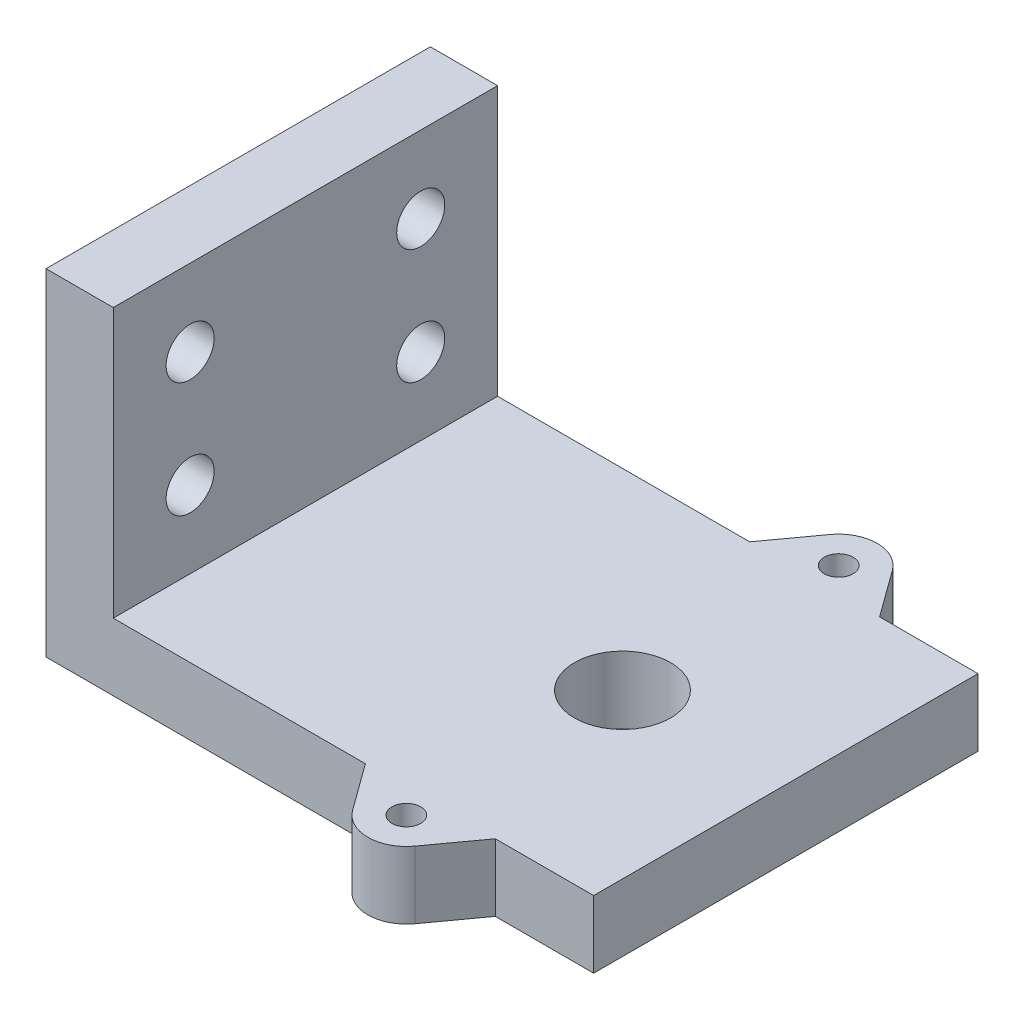
ISO-10303-21;
HEADER;
FILE_DESCRIPTION(('STEP AP214'),'2;1');
FILE_NAME('part.step','',(''),(''),'','','');
FILE_SCHEMA(('AUTOMOTIVE_DESIGN { 1 0 10303 214 1 1 1 1 }'));
ENDSEC;
DATA;
#1=APPLICATION_CONTEXT('core data for automotive mechanical design processes');
#2=APPLICATION_PROTOCOL_DEFINITION('international standard','automotive_design',2000,#1);
#3=PRODUCT_CONTEXT('',#1,'mechanical');
#4=PRODUCT('Part','Part','',(#3));
#5=PRODUCT_RELATED_PRODUCT_CATEGORY('part','',(#4));
#6=PRODUCT_DEFINITION_FORMATION('','',#4);
#7=PRODUCT_DEFINITION_CONTEXT('part definition',#1,'design');
#8=PRODUCT_DEFINITION('design','',#6,#7);
#9=PRODUCT_DEFINITION_SHAPE('','',#8);
#10=(LENGTH_UNIT() NAMED_UNIT(*) SI_UNIT(.MILLI.,.METRE.));
#11=(NAMED_UNIT(*) PLANE_ANGLE_UNIT() SI_UNIT($,.RADIAN.));
#12=(NAMED_UNIT(*) SI_UNIT($,.STERADIAN.) SOLID_ANGLE_UNIT());
#13=UNCERTAINTY_MEASURE_WITH_UNIT(LENGTH_MEASURE(1.E-05),#10,'distance_accuracy_value','');
#14=(GEOMETRIC_REPRESENTATION_CONTEXT(3) GLOBAL_UNCERTAINTY_ASSIGNED_CONTEXT((#13)) GLOBAL_UNIT_ASSIGNED_CONTEXT((#10,
#11,#12)) REPRESENTATION_CONTEXT('',''));
#15=CARTESIAN_POINT('',(0.,0.,0.));
#16=DIRECTION('',(0.,0.,1.));
#17=DIRECTION('',(1.,0.,0.));
#18=AXIS2_PLACEMENT_3D('',#15,#16,#17);
#19=CARTESIAN_POINT('',(0.,0.,-20.));
#20=DIRECTION('',(0.,0.,-1.));
#21=DIRECTION('',(-1.,0.,0.));
#22=AXIS2_PLACEMENT_3D('',#19,#20,#21);
#23=PLANE('',#22);
#24=DIRECTION('',(1.,0.,0.));
#25=VECTOR('',#24,1.);
#26=CARTESIAN_POINT('',(57.,0.,-20.));
#27=LINE('',#26,#25);
#28=CARTESIAN_POINT('',(46.7638746292343,0.,-20.));
#29=VERTEX_POINT('',#28);
#30=CARTESIAN_POINT('',(57.,0.,-20.));
#31=VERTEX_POINT('',#30);
#32=EDGE_CURVE('E55',#29,#31,#27,.T.);
#33=ORIENTED_EDGE('',*,*,#32,.F.);
#34=DIRECTION('',(0.,1.,0.));
#35=VECTOR('',#34,1.);
#36=CARTESIAN_POINT('',(46.7638746292343,-15.0083310198037,-20.));
#37=LINE('',#36,#35);
#38=CARTESIAN_POINT('',(46.7638746292343,7.,-20.));
#39=VERTEX_POINT('',#38);
#40=EDGE_CURVE('E50',#29,#39,#37,.T.);
#41=ORIENTED_EDGE('',*,*,#40,.T.);
#42=DIRECTION('',(-1.,0.,0.));
#43=VECTOR('',#42,1.);
#44=CARTESIAN_POINT('',(7.,7.,-20.));
#45=LINE('',#44,#43);
#46=CARTESIAN_POINT('',(57.,7.,-20.));
#47=VERTEX_POINT('',#46);
#48=EDGE_CURVE('E257',#47,#39,#45,.T.);
#49=ORIENTED_EDGE('',*,*,#48,.F.);
#50=DIRECTION('',(0.,1.,0.));
#51=VECTOR('',#50,1.);
#52=CARTESIAN_POINT('',(57.,7.,-20.));
#53=LINE('',#52,#51);
#54=EDGE_CURVE('E254',#31,#47,#53,.T.);
#55=ORIENTED_EDGE('',*,*,#54,.F.);
#56=EDGE_LOOP('',(#33,#41,#49,#55));
#57=FACE_BOUND('',#56,.T.);
#58=ADVANCED_FACE('F35',(#57),#23,.T.);
#59=CARTESIAN_POINT('',(0.,0.,20.));
#60=DIRECTION('',(0.,0.,-1.));
#61=DIRECTION('',(-1.,0.,0.));
#62=AXIS2_PLACEMENT_3D('',#59,#60,#61);
#63=PLANE('',#62);
#64=DIRECTION('',(0.,1.,0.));
#65=VECTOR('',#64,1.);
#66=CARTESIAN_POINT('',(46.7638746292344,-15.0083310198037,20.));
#67=LINE('',#66,#65);
#68=CARTESIAN_POINT('',(46.7638746292344,0.,20.));
#69=VERTEX_POINT('',#68);
#70=CARTESIAN_POINT('',(46.7638746292344,7.,20.));
#71=VERTEX_POINT('',#70);
#72=EDGE_CURVE('E200',#69,#71,#67,.T.);
#73=ORIENTED_EDGE('',*,*,#72,.F.);
#74=DIRECTION('',(1.,0.,0.));
#75=VECTOR('',#74,1.);
#76=CARTESIAN_POINT('',(57.,0.,20.));
#77=LINE('',#76,#75);
#78=CARTESIAN_POINT('',(57.,0.,20.));
#79=VERTEX_POINT('',#78);
#80=EDGE_CURVE('E239',#69,#79,#77,.T.);
#81=ORIENTED_EDGE('',*,*,#80,.T.);
#82=DIRECTION('',(0.,1.,0.));
#83=VECTOR('',#82,1.);
#84=CARTESIAN_POINT('',(57.,7.,20.));
#85=LINE('',#84,#83);
#86=CARTESIAN_POINT('',(57.,7.,20.));
#87=VERTEX_POINT('',#86);
#88=EDGE_CURVE('E238',#79,#87,#85,.T.);
#89=ORIENTED_EDGE('',*,*,#88,.T.);
#90=DIRECTION('',(-1.,0.,0.));
#91=VECTOR('',#90,1.);
#92=CARTESIAN_POINT('',(7.,7.,20.));
#93=LINE('',#92,#91);
#94=EDGE_CURVE('E242',#87,#71,#93,.T.);
#95=ORIENTED_EDGE('',*,*,#94,.T.);
#96=EDGE_LOOP('',(#73,#81,#89,#95));
#97=FACE_BOUND('',#96,.T.);
#98=ADVANCED_FACE('F302',(#97),#63,.F.);
#99=CARTESIAN_POINT('',(57.,0.,20.));
#100=DIRECTION('',(0.,1.,0.));
#101=DIRECTION('',(0.,0.,1.));
#102=AXIS2_PLACEMENT_3D('',#99,#100,#101);
#103=PLANE('',#102);
#104=CARTESIAN_POINT('',(40.,0.,0.));
#105=DIRECTION('',(0.,1.,0.));
#106=DIRECTION('',(0.,0.,1.));
#107=AXIS2_PLACEMENT_3D('',#104,#105,#106);
#108=CIRCLE('',#107,5.);
#109=CARTESIAN_POINT('',(40.,0.,5.));
#110=VERTEX_POINT('',#109);
#111=EDGE_CURVE('E231',#110,#110,#108,.T.);
#112=ORIENTED_EDGE('',*,*,#111,.T.);
#113=EDGE_LOOP('',(#112));
#114=FACE_BOUND('',#113,.T.);
#115=CARTESIAN_POINT('',(0.,0.,-20.));
#116=VERTEX_POINT('',#115);
#117=CARTESIAN_POINT('',(33.2361253707657,0.,-20.));
#118=VERTEX_POINT('',#117);
#119=EDGE_CURVE('E251',#116,#118,#27,.T.);
#120=ORIENTED_EDGE('',*,*,#119,.T.);
#121=DIRECTION('',(0.58813938029627,0.,-0.80875958686418));
#122=VECTOR('',#121,1.);
#123=CARTESIAN_POINT('',(36.7649616525433,0.,-24.8525575211851));
#124=LINE('',#123,#122);
#125=CARTESIAN_POINT('',(36.7649616525433,0.,-24.8525575211851));
#126=VERTEX_POINT('',#125);
#127=EDGE_CURVE('E175',#118,#126,#124,.T.);
#128=ORIENTED_EDGE('',*,*,#127,.T.);
#129=CARTESIAN_POINT('',(40.,0.,-22.5));
#130=DIRECTION('',(0.,1.,0.));
#131=DIRECTION('',(0.,0.,1.));
#132=AXIS2_PLACEMENT_3D('',#129,#130,#131);
#133=CIRCLE('',#132,4.);
#134=CARTESIAN_POINT('',(43.2350383474567,0.,-24.8525575211851));
#135=VERTEX_POINT('',#134);
#136=EDGE_CURVE('E144',#126,#135,#133,.F.);
#137=ORIENTED_EDGE('',*,*,#136,.T.);
#138=DIRECTION('',(0.588139380296272,0.,0.808759586864179));
#139=VECTOR('',#138,1.);
#140=CARTESIAN_POINT('',(43.2350383474567,0.,-24.8525575211851));
#141=LINE('',#140,#139);
#142=EDGE_CURVE('E168',#135,#29,#141,.T.);
#143=ORIENTED_EDGE('',*,*,#142,.T.);
#144=ORIENTED_EDGE('',*,*,#32,.T.);
#145=DIRECTION('',(0.,0.,-1.));
#146=VECTOR('',#145,1.);
#147=CARTESIAN_POINT('',(57.,0.,20.));
#148=LINE('',#147,#146);
#149=EDGE_CURVE('E11',#79,#31,#148,.T.);
#150=ORIENTED_EDGE('',*,*,#149,.F.);
#151=ORIENTED_EDGE('',*,*,#80,.F.);
#152=DIRECTION('',(-0.588139380296271,0.,0.808759586864179));
#153=VECTOR('',#152,1.);
#154=CARTESIAN_POINT('',(43.2350383474567,0.,24.8525575211851));
#155=LINE('',#154,#153);
#156=CARTESIAN_POINT('',(43.2350383474567,0.,24.8525575211851));
#157=VERTEX_POINT('',#156);
#158=EDGE_CURVE('E176',#69,#157,#155,.T.);
#159=ORIENTED_EDGE('',*,*,#158,.T.);
#160=CARTESIAN_POINT('',(40.,0.,22.5));
#161=DIRECTION('',(0.,1.,0.));
#162=DIRECTION('',(0.,0.,1.));
#163=AXIS2_PLACEMENT_3D('',#160,#161,#162);
#164=CIRCLE('',#163,4.00000000000001);
#165=CARTESIAN_POINT('',(36.7649616525433,0.,24.8525575211851));
#166=VERTEX_POINT('',#165);
#167=EDGE_CURVE('E179',#157,#166,#164,.F.);
#168=ORIENTED_EDGE('',*,*,#167,.T.);
#169=DIRECTION('',(-0.588139380296271,0.,-0.80875958686418));
#170=VECTOR('',#169,1.);
#171=CARTESIAN_POINT('',(36.7649616525433,0.,24.8525575211851));
#172=LINE('',#171,#170);
#173=CARTESIAN_POINT('',(33.2361253707657,0.,20.));
#174=VERTEX_POINT('',#173);
#175=EDGE_CURVE('E180',#166,#174,#172,.T.);
#176=ORIENTED_EDGE('',*,*,#175,.T.);
#177=CARTESIAN_POINT('',(0.,0.,20.));
#178=VERTEX_POINT('',#177);
#179=EDGE_CURVE('E236',#178,#174,#77,.T.);
#180=ORIENTED_EDGE('',*,*,#179,.F.);
#181=DIRECTION('',(0.,0.,-1.));
#182=VECTOR('',#181,1.);
#183=CARTESIAN_POINT('',(0.,0.,20.));
#184=LINE('',#183,#182);
#185=EDGE_CURVE('E250',#178,#116,#184,.T.);
#186=ORIENTED_EDGE('',*,*,#185,.T.);
#187=EDGE_LOOP('',(#120,#128,#137,#143,#144,#150,#151,#159,#168,#176,#180,#186));
#188=FACE_BOUND('',#187,.T.);
#189=CARTESIAN_POINT('',(40.,0.,22.5));
#190=DIRECTION('',(0.,1.,0.));
#191=DIRECTION('',(0.,0.,1.));
#192=AXIS2_PLACEMENT_3D('',#189,#190,#191);
#193=CIRCLE('',#192,1.5);
#194=CARTESIAN_POINT('',(40.,0.,24.));
#195=VERTEX_POINT('',#194);
#196=EDGE_CURVE('E178',#195,#195,#193,.F.);
#197=ORIENTED_EDGE('',*,*,#196,.F.);
#198=EDGE_LOOP('',(#197));
#199=FACE_BOUND('',#198,.T.);
#200=CARTESIAN_POINT('',(40.,0.,-22.5));
#201=DIRECTION('',(0.,1.,0.));
#202=DIRECTION('',(0.,0.,1.));
#203=AXIS2_PLACEMENT_3D('',#200,#201,#202);
#204=CIRCLE('',#203,1.5);
#205=CARTESIAN_POINT('',(40.,0.,-21.));
#206=VERTEX_POINT('',#205);
#207=EDGE_CURVE('E171',#206,#206,#204,.F.);
#208=ORIENTED_EDGE('',*,*,#207,.F.);
#209=EDGE_LOOP('',(#208));
#210=FACE_BOUND('',#209,.T.);
#211=ADVANCED_FACE('F37',(#114,#188,#199,#210),#103,.F.);
#212=CARTESIAN_POINT('',(57.,7.,20.));
#213=DIRECTION('',(-1.,0.,0.));
#214=DIRECTION('',(0.,0.,1.));
#215=AXIS2_PLACEMENT_3D('',#212,#213,#214);
#216=PLANE('',#215);
#217=ORIENTED_EDGE('',*,*,#54,.T.);
#218=DIRECTION('',(0.,0.,-1.));
#219=VECTOR('',#218,1.);
#220=CARTESIAN_POINT('',(57.,7.,20.));
#221=LINE('',#220,#219);
#222=EDGE_CURVE('E43',#87,#47,#221,.T.);
#223=ORIENTED_EDGE('',*,*,#222,.F.);
#224=ORIENTED_EDGE('',*,*,#88,.F.);
#225=ORIENTED_EDGE('',*,*,#149,.T.);
#226=EDGE_LOOP('',(#217,#223,#224,#225));
#227=FACE_BOUND('',#226,.T.);
#228=ADVANCED_FACE('F281',(#227),#216,.F.);
#229=CARTESIAN_POINT('',(7.,7.,20.));
#230=DIRECTION('',(0.,-1.,0.));
#231=DIRECTION('',(0.,0.,-1.));
#232=AXIS2_PLACEMENT_3D('',#229,#230,#231);
#233=PLANE('',#232);
#234=CARTESIAN_POINT('',(40.,7.,0.));
#235=DIRECTION('',(0.,1.,0.));
#236=DIRECTION('',(0.,0.,1.));
#237=AXIS2_PLACEMENT_3D('',#234,#235,#236);
#238=CIRCLE('',#237,5.);
#239=CARTESIAN_POINT('',(40.,7.,5.));
#240=VERTEX_POINT('',#239);
#241=EDGE_CURVE('E228',#240,#240,#238,.T.);
#242=ORIENTED_EDGE('',*,*,#241,.F.);
#243=EDGE_LOOP('',(#242));
#244=FACE_BOUND('',#243,.T.);
#245=ORIENTED_EDGE('',*,*,#48,.T.);
#246=DIRECTION('',(-0.588139380296272,0.,-0.808759586864179));
#247=VECTOR('',#246,1.);
#248=CARTESIAN_POINT('',(43.2350383474567,7.,-24.8525575211851));
#249=LINE('',#248,#247);
#250=CARTESIAN_POINT('',(43.2350383474567,7.,-24.8525575211851));
#251=VERTEX_POINT('',#250);
#252=EDGE_CURVE('E148',#39,#251,#249,.T.);
#253=ORIENTED_EDGE('',*,*,#252,.T.);
#254=CARTESIAN_POINT('',(40.,7.,-22.5));
#255=DIRECTION('',(0.,1.,0.));
#256=DIRECTION('',(0.,0.,-1.));
#257=AXIS2_PLACEMENT_3D('',#254,#255,#256);
#258=CIRCLE('',#257,4.);
#259=CARTESIAN_POINT('',(36.7649616525433,7.,-24.8525575211851));
#260=VERTEX_POINT('',#259);
#261=EDGE_CURVE('E142',#251,#260,#258,.T.);
#262=ORIENTED_EDGE('',*,*,#261,.T.);
#263=DIRECTION('',(-0.58813938029627,0.,0.80875958686418));
#264=VECTOR('',#263,1.);
#265=CARTESIAN_POINT('',(36.7649616525433,7.,-24.8525575211851));
#266=LINE('',#265,#264);
#267=CARTESIAN_POINT('',(33.2361253707656,7.,-20.));
#268=VERTEX_POINT('',#267);
#269=EDGE_CURVE('E152',#260,#268,#266,.T.);
#270=ORIENTED_EDGE('',*,*,#269,.T.);
#271=CARTESIAN_POINT('',(7.,7.,-20.));
#272=VERTEX_POINT('',#271);
#273=EDGE_CURVE('E256',#268,#272,#45,.T.);
#274=ORIENTED_EDGE('',*,*,#273,.T.);
#275=DIRECTION('',(0.,0.,-1.));
#276=VECTOR('',#275,1.);
#277=CARTESIAN_POINT('',(7.,7.,20.));
#278=LINE('',#277,#276);
#279=CARTESIAN_POINT('',(7.,7.,20.));
#280=VERTEX_POINT('',#279);
#281=EDGE_CURVE('E273',#280,#272,#278,.T.);
#282=ORIENTED_EDGE('',*,*,#281,.F.);
#283=CARTESIAN_POINT('',(33.2361253707657,7.,20.));
#284=VERTEX_POINT('',#283);
#285=EDGE_CURVE('E241',#284,#280,#93,.T.);
#286=ORIENTED_EDGE('',*,*,#285,.F.);
#287=DIRECTION('',(0.58813938029627,0.,0.80875958686418));
#288=VECTOR('',#287,1.);
#289=CARTESIAN_POINT('',(36.7649616525433,7.,24.8525575211851));
#290=LINE('',#289,#288);
#291=CARTESIAN_POINT('',(36.7649616525433,7.,24.8525575211851));
#292=VERTEX_POINT('',#291);
#293=EDGE_CURVE('E193',#284,#292,#290,.T.);
#294=ORIENTED_EDGE('',*,*,#293,.T.);
#295=CARTESIAN_POINT('',(40.,7.,22.5));
#296=DIRECTION('',(0.,1.,0.));
#297=DIRECTION('',(0.,0.,1.));
#298=AXIS2_PLACEMENT_3D('',#295,#296,#297);
#299=CIRCLE('',#298,4.00000000000001);
#300=CARTESIAN_POINT('',(43.2350383474567,7.,24.8525575211851));
#301=VERTEX_POINT('',#300);
#302=EDGE_CURVE('E187',#292,#301,#299,.T.);
#303=ORIENTED_EDGE('',*,*,#302,.T.);
#304=DIRECTION('',(0.588139380296271,0.,-0.808759586864179));
#305=VECTOR('',#304,1.);
#306=CARTESIAN_POINT('',(43.2350383474567,7.,24.8525575211851));
#307=LINE('',#306,#305);
#308=EDGE_CURVE('E190',#301,#71,#307,.T.);
#309=ORIENTED_EDGE('',*,*,#308,.T.);
#310=ORIENTED_EDGE('',*,*,#94,.F.);
#311=ORIENTED_EDGE('',*,*,#222,.T.);
#312=EDGE_LOOP('',(#245,#253,#262,#270,#274,#282,#286,#294,#303,#309,#310,#311));
#313=FACE_BOUND('',#312,.T.);
#314=CARTESIAN_POINT('',(40.,7.,22.5));
#315=DIRECTION('',(0.,1.,0.));
#316=DIRECTION('',(0.,0.,1.));
#317=AXIS2_PLACEMENT_3D('',#314,#315,#316);
#318=CIRCLE('',#317,1.5);
#319=CARTESIAN_POINT('',(40.,7.,24.));
#320=VERTEX_POINT('',#319);
#321=EDGE_CURVE('E174',#320,#320,#318,.T.);
#322=ORIENTED_EDGE('',*,*,#321,.F.);
#323=EDGE_LOOP('',(#322));
#324=FACE_BOUND('',#323,.T.);
#325=CARTESIAN_POINT('',(40.,7.,-22.5));
#326=DIRECTION('',(0.,1.,0.));
#327=DIRECTION('',(0.,0.,1.));
#328=AXIS2_PLACEMENT_3D('',#325,#326,#327);
#329=CIRCLE('',#328,1.5);
#330=CARTESIAN_POINT('',(40.,7.,-21.));
#331=VERTEX_POINT('',#330);
#332=EDGE_CURVE('E159',#331,#331,#329,.T.);
#333=ORIENTED_EDGE('',*,*,#332,.F.);
#334=EDGE_LOOP('',(#333));
#335=FACE_BOUND('',#334,.T.);
#336=ADVANCED_FACE('F156',(#244,#313,#324,#335),#233,.F.);
#337=CARTESIAN_POINT('',(7.,35.,20.));
#338=DIRECTION('',(-1.,0.,0.));
#339=DIRECTION('',(0.,-1.,0.));
#340=AXIS2_PLACEMENT_3D('',#337,#338,#339);
#341=PLANE('',#340);
#342=CARTESIAN_POINT('',(7.,15.,-12.));
#343=DIRECTION('',(1.,0.,0.));
#344=DIRECTION('',(0.,1.,0.));
#345=AXIS2_PLACEMENT_3D('',#342,#343,#344);
#346=CIRCLE('',#345,2.5);
#347=CARTESIAN_POINT('',(7.,17.5,-12.));
#348=VERTEX_POINT('',#347);
#349=EDGE_CURVE('E217',#348,#348,#346,.T.);
#350=ORIENTED_EDGE('',*,*,#349,.F.);
#351=EDGE_LOOP('',(#350));
#352=FACE_BOUND('',#351,.T.);
#353=CARTESIAN_POINT('',(7.,27.,12.));
#354=DIRECTION('',(1.,0.,0.));
#355=DIRECTION('',(0.,1.,0.));
#356=AXIS2_PLACEMENT_3D('',#353,#354,#355);
#357=CIRCLE('',#356,2.5);
#358=CARTESIAN_POINT('',(7.,29.5,12.));
#359=VERTEX_POINT('',#358);
#360=EDGE_CURVE('E210',#359,#359,#357,.T.);
#361=ORIENTED_EDGE('',*,*,#360,.F.);
#362=EDGE_LOOP('',(#361));
#363=FACE_BOUND('',#362,.T.);
#364=CARTESIAN_POINT('',(7.,15.,12.));
#365=DIRECTION('',(1.,0.,0.));
#366=DIRECTION('',(0.,1.,0.));
#367=AXIS2_PLACEMENT_3D('',#364,#365,#366);
#368=CIRCLE('',#367,2.5);
#369=CARTESIAN_POINT('',(7.,17.5,12.));
#370=VERTEX_POINT('',#369);
#371=EDGE_CURVE('E206',#370,#370,#368,.T.);
#372=ORIENTED_EDGE('',*,*,#371,.F.);
#373=EDGE_LOOP('',(#372));
#374=FACE_BOUND('',#373,.T.);
#375=CARTESIAN_POINT('',(7.,27.,-12.));
#376=DIRECTION('',(1.,0.,0.));
#377=DIRECTION('',(0.,1.,0.));
#378=AXIS2_PLACEMENT_3D('',#375,#376,#377);
#379=CIRCLE('',#378,2.5);
#380=CARTESIAN_POINT('',(7.,29.5,-12.));
#381=VERTEX_POINT('',#380);
#382=EDGE_CURVE('E216',#381,#381,#379,.T.);
#383=ORIENTED_EDGE('',*,*,#382,.F.);
#384=EDGE_LOOP('',(#383));
#385=FACE_BOUND('',#384,.T.);
#386=DIRECTION('',(0.,1.,0.));
#387=VECTOR('',#386,1.);
#388=CARTESIAN_POINT('',(7.,35.,-20.));
#389=LINE('',#388,#387);
#390=CARTESIAN_POINT('',(7.,35.,-20.));
#391=VERTEX_POINT('',#390);
#392=EDGE_CURVE('E259',#272,#391,#389,.T.);
#393=ORIENTED_EDGE('',*,*,#392,.T.);
#394=DIRECTION('',(0.,0.,-1.));
#395=VECTOR('',#394,1.);
#396=CARTESIAN_POINT('',(7.,35.,20.));
#397=LINE('',#396,#395);
#398=CARTESIAN_POINT('',(7.,35.,20.));
#399=VERTEX_POINT('',#398);
#400=EDGE_CURVE('E270',#399,#391,#397,.T.);
#401=ORIENTED_EDGE('',*,*,#400,.F.);
#402=DIRECTION('',(0.,1.,0.));
#403=VECTOR('',#402,1.);
#404=CARTESIAN_POINT('',(7.,35.,20.));
#405=LINE('',#404,#403);
#406=EDGE_CURVE('E244',#280,#399,#405,.T.);
#407=ORIENTED_EDGE('',*,*,#406,.F.);
#408=ORIENTED_EDGE('',*,*,#281,.T.);
#409=EDGE_LOOP('',(#393,#401,#407,#408));
#410=FACE_BOUND('',#409,.T.);
#411=ADVANCED_FACE('F340',(#352,#363,#374,#385,#410),#341,.F.);
#412=CARTESIAN_POINT('',(0.,35.,20.));
#413=DIRECTION('',(0.,-1.,0.));
#414=DIRECTION('',(0.,0.,-1.));
#415=AXIS2_PLACEMENT_3D('',#412,#413,#414);
#416=PLANE('',#415);
#417=DIRECTION('',(-1.,0.,0.));
#418=VECTOR('',#417,1.);
#419=CARTESIAN_POINT('',(0.,35.,-20.));
#420=LINE('',#419,#418);
#421=CARTESIAN_POINT('',(0.,35.,-20.));
#422=VERTEX_POINT('',#421);
#423=EDGE_CURVE('E261',#391,#422,#420,.T.);
#424=ORIENTED_EDGE('',*,*,#423,.T.);
#425=DIRECTION('',(0.,0.,-1.));
#426=VECTOR('',#425,1.);
#427=CARTESIAN_POINT('',(0.,35.,20.));
#428=LINE('',#427,#426);
#429=CARTESIAN_POINT('',(0.,35.,20.));
#430=VERTEX_POINT('',#429);
#431=EDGE_CURVE('E267',#430,#422,#428,.T.);
#432=ORIENTED_EDGE('',*,*,#431,.F.);
#433=DIRECTION('',(-1.,0.,0.));
#434=VECTOR('',#433,1.);
#435=CARTESIAN_POINT('',(0.,35.,20.));
#436=LINE('',#435,#434);
#437=EDGE_CURVE('E246',#399,#430,#436,.T.);
#438=ORIENTED_EDGE('',*,*,#437,.F.);
#439=ORIENTED_EDGE('',*,*,#400,.T.);
#440=EDGE_LOOP('',(#424,#432,#438,#439));
#441=FACE_BOUND('',#440,.T.);
#442=ADVANCED_FACE('F335',(#441),#416,.F.);
#443=CARTESIAN_POINT('',(0.,0.,20.));
#444=DIRECTION('',(1.,0.,0.));
#445=DIRECTION('',(0.,0.,-1.));
#446=AXIS2_PLACEMENT_3D('',#443,#444,#445);
#447=PLANE('',#446);
#448=CARTESIAN_POINT('',(0.,15.,-12.));
#449=DIRECTION('',(1.,0.,0.));
#450=DIRECTION('',(0.,1.,0.));
#451=AXIS2_PLACEMENT_3D('',#448,#449,#450);
#452=CIRCLE('',#451,2.5);
#453=CARTESIAN_POINT('',(0.,17.5,-12.));
#454=VERTEX_POINT('',#453);
#455=EDGE_CURVE('E213',#454,#454,#452,.T.);
#456=ORIENTED_EDGE('',*,*,#455,.T.);
#457=EDGE_LOOP('',(#456));
#458=FACE_BOUND('',#457,.T.);
#459=CARTESIAN_POINT('',(0.,27.,12.));
#460=DIRECTION('',(1.,0.,0.));
#461=DIRECTION('',(0.,1.,0.));
#462=AXIS2_PLACEMENT_3D('',#459,#460,#461);
#463=CIRCLE('',#462,2.5);
#464=CARTESIAN_POINT('',(0.,29.5,12.));
#465=VERTEX_POINT('',#464);
#466=EDGE_CURVE('E220',#465,#465,#463,.T.);
#467=ORIENTED_EDGE('',*,*,#466,.T.);
#468=EDGE_LOOP('',(#467));
#469=FACE_BOUND('',#468,.T.);
#470=CARTESIAN_POINT('',(0.,15.,12.));
#471=DIRECTION('',(1.,0.,0.));
#472=DIRECTION('',(0.,1.,0.));
#473=AXIS2_PLACEMENT_3D('',#470,#471,#472);
#474=CIRCLE('',#473,2.5);
#475=CARTESIAN_POINT('',(0.,17.5,12.));
#476=VERTEX_POINT('',#475);
#477=EDGE_CURVE('E207',#476,#476,#474,.T.);
#478=ORIENTED_EDGE('',*,*,#477,.T.);
#479=EDGE_LOOP('',(#478));
#480=FACE_BOUND('',#479,.T.);
#481=CARTESIAN_POINT('',(0.,27.,-12.));
#482=DIRECTION('',(1.,0.,0.));
#483=DIRECTION('',(0.,1.,0.));
#484=AXIS2_PLACEMENT_3D('',#481,#482,#483);
#485=CIRCLE('',#484,2.5);
#486=CARTESIAN_POINT('',(0.,29.5,-12.));
#487=VERTEX_POINT('',#486);
#488=EDGE_CURVE('E225',#487,#487,#485,.T.);
#489=ORIENTED_EDGE('',*,*,#488,.T.);
#490=EDGE_LOOP('',(#489));
#491=FACE_BOUND('',#490,.T.);
#492=DIRECTION('',(0.,-1.,0.));
#493=VECTOR('',#492,1.);
#494=CARTESIAN_POINT('',(0.,0.,-20.));
#495=LINE('',#494,#493);
#496=EDGE_CURVE('E263',#422,#116,#495,.T.);
#497=ORIENTED_EDGE('',*,*,#496,.T.);
#498=ORIENTED_EDGE('',*,*,#185,.F.);
#499=DIRECTION('',(0.,-1.,0.));
#500=VECTOR('',#499,1.);
#501=CARTESIAN_POINT('',(0.,0.,20.));
#502=LINE('',#501,#500);
#503=EDGE_CURVE('E248',#430,#178,#502,.T.);
#504=ORIENTED_EDGE('',*,*,#503,.F.);
#505=ORIENTED_EDGE('',*,*,#431,.T.);
#506=EDGE_LOOP('',(#497,#498,#504,#505));
#507=FACE_BOUND('',#506,.T.);
#508=ADVANCED_FACE('F322',(#458,#469,#480,#491,#507),#447,.F.);
#509=ORIENTED_EDGE('',*,*,#179,.T.);
#510=DIRECTION('',(0.,1.,0.));
#511=VECTOR('',#510,1.);
#512=CARTESIAN_POINT('',(33.2361253707657,-15.0083310198037,20.));
#513=LINE('',#512,#511);
#514=EDGE_CURVE('E198',#174,#284,#513,.T.);
#515=ORIENTED_EDGE('',*,*,#514,.T.);
#516=ORIENTED_EDGE('',*,*,#285,.T.);
#517=ORIENTED_EDGE('',*,*,#406,.T.);
#518=ORIENTED_EDGE('',*,*,#437,.T.);
#519=ORIENTED_EDGE('',*,*,#503,.T.);
#520=EDGE_LOOP('',(#509,#515,#516,#517,#518,#519));
#521=FACE_BOUND('',#520,.T.);
#522=ADVANCED_FACE('F310',(#521),#63,.F.);
#523=DIRECTION('',(0.,1.,0.));
#524=VECTOR('',#523,1.);
#525=CARTESIAN_POINT('',(33.2361253707656,-15.0083310198037,-20.));
#526=LINE('',#525,#524);
#527=EDGE_CURVE('E147',#118,#268,#526,.T.);
#528=ORIENTED_EDGE('',*,*,#527,.F.);
#529=ORIENTED_EDGE('',*,*,#119,.F.);
#530=ORIENTED_EDGE('',*,*,#496,.F.);
#531=ORIENTED_EDGE('',*,*,#423,.F.);
#532=ORIENTED_EDGE('',*,*,#392,.F.);
#533=ORIENTED_EDGE('',*,*,#273,.F.);
#534=EDGE_LOOP('',(#528,#529,#530,#531,#532,#533));
#535=FACE_BOUND('',#534,.T.);
#536=ADVANCED_FACE('F304',(#535),#23,.T.);
#537=CARTESIAN_POINT('',(40.,0.,0.));
#538=DIRECTION('',(0.,1.,0.));
#539=DIRECTION('',(0.,0.,1.));
#540=AXIS2_PLACEMENT_3D('',#537,#538,#539);
#541=CYLINDRICAL_SURFACE('',#540,5.);
#542=ORIENTED_EDGE('',*,*,#111,.F.);
#543=EDGE_LOOP('',(#542));
#544=FACE_BOUND('',#543,.T.);
#545=ORIENTED_EDGE('',*,*,#241,.T.);
#546=EDGE_LOOP('',(#545));
#547=FACE_BOUND('',#546,.T.);
#548=ADVANCED_FACE('F313',(#544,#547),#541,.F.);
#549=CARTESIAN_POINT('',(0.,27.,-12.));
#550=DIRECTION('',(1.,0.,0.));
#551=DIRECTION('',(0.,1.,0.));
#552=AXIS2_PLACEMENT_3D('',#549,#550,#551);
#553=CYLINDRICAL_SURFACE('',#552,2.5);
#554=ORIENTED_EDGE('',*,*,#488,.F.);
#555=EDGE_LOOP('',(#554));
#556=FACE_BOUND('',#555,.T.);
#557=ORIENTED_EDGE('',*,*,#382,.T.);
#558=EDGE_LOOP('',(#557));
#559=FACE_BOUND('',#558,.T.);
#560=ADVANCED_FACE('F319',(#556,#559),#553,.F.);
#561=CARTESIAN_POINT('',(0.,15.,12.));
#562=DIRECTION('',(1.,0.,0.));
#563=DIRECTION('',(0.,1.,0.));
#564=AXIS2_PLACEMENT_3D('',#561,#562,#563);
#565=CYLINDRICAL_SURFACE('',#564,2.5);
#566=ORIENTED_EDGE('',*,*,#477,.F.);
#567=EDGE_LOOP('',(#566));
#568=FACE_BOUND('',#567,.T.);
#569=ORIENTED_EDGE('',*,*,#371,.T.);
#570=EDGE_LOOP('',(#569));
#571=FACE_BOUND('',#570,.T.);
#572=ADVANCED_FACE('F372',(#568,#571),#565,.F.);
#573=CARTESIAN_POINT('',(0.,27.,12.));
#574=DIRECTION('',(1.,0.,0.));
#575=DIRECTION('',(0.,1.,0.));
#576=AXIS2_PLACEMENT_3D('',#573,#574,#575);
#577=CYLINDRICAL_SURFACE('',#576,2.5);
#578=ORIENTED_EDGE('',*,*,#466,.F.);
#579=EDGE_LOOP('',(#578));
#580=FACE_BOUND('',#579,.T.);
#581=ORIENTED_EDGE('',*,*,#360,.T.);
#582=EDGE_LOOP('',(#581));
#583=FACE_BOUND('',#582,.T.);
#584=ADVANCED_FACE('F365',(#580,#583),#577,.F.);
#585=CARTESIAN_POINT('',(0.,15.,-12.));
#586=DIRECTION('',(1.,0.,0.));
#587=DIRECTION('',(0.,1.,0.));
#588=AXIS2_PLACEMENT_3D('',#585,#586,#587);
#589=CYLINDRICAL_SURFACE('',#588,2.5);
#590=ORIENTED_EDGE('',*,*,#455,.F.);
#591=EDGE_LOOP('',(#590));
#592=FACE_BOUND('',#591,.T.);
#593=ORIENTED_EDGE('',*,*,#349,.T.);
#594=EDGE_LOOP('',(#593));
#595=FACE_BOUND('',#594,.T.);
#596=ADVANCED_FACE('F358',(#592,#595),#589,.F.);
#597=CARTESIAN_POINT('',(43.2350383474567,-15.0083310198037,24.8525575211851));
#598=DIRECTION('',(0.808759586864179,0.,0.588139380296271));
#599=DIRECTION('',(0.588139380296271,0.,-0.808759586864179));
#600=AXIS2_PLACEMENT_3D('',#597,#598,#599);
#601=PLANE('',#600);
#602=ORIENTED_EDGE('',*,*,#158,.F.);
#603=ORIENTED_EDGE('',*,*,#72,.T.);
#604=ORIENTED_EDGE('',*,*,#308,.F.);
#605=DIRECTION('',(0.,1.,0.));
#606=VECTOR('',#605,1.);
#607=CARTESIAN_POINT('',(43.2350383474567,-15.0083310198037,24.8525575211851));
#608=LINE('',#607,#606);
#609=EDGE_CURVE('E196',#157,#301,#608,.T.);
#610=ORIENTED_EDGE('',*,*,#609,.F.);
#611=EDGE_LOOP('',(#602,#603,#604,#610));
#612=FACE_BOUND('',#611,.T.);
#613=ADVANCED_FACE('F356',(#612),#601,.T.);
#614=CARTESIAN_POINT('',(36.7649616525433,-15.0083310198037,24.8525575211851));
#615=DIRECTION('',(-0.80875958686418,0.,0.588139380296271));
#616=DIRECTION('',(0.588139380296271,0.,0.80875958686418));
#617=AXIS2_PLACEMENT_3D('',#614,#615,#616);
#618=PLANE('',#617);
#619=ORIENTED_EDGE('',*,*,#175,.F.);
#620=DIRECTION('',(0.,1.,0.));
#621=VECTOR('',#620,1.);
#622=CARTESIAN_POINT('',(36.7649616525433,-15.0083310198037,24.8525575211851));
#623=LINE('',#622,#621);
#624=EDGE_CURVE('E183',#166,#292,#623,.T.);
#625=ORIENTED_EDGE('',*,*,#624,.T.);
#626=ORIENTED_EDGE('',*,*,#293,.F.);
#627=ORIENTED_EDGE('',*,*,#514,.F.);
#628=EDGE_LOOP('',(#619,#625,#626,#627));
#629=FACE_BOUND('',#628,.T.);
#630=ADVANCED_FACE('F347',(#629),#618,.T.);
#631=CARTESIAN_POINT('',(40.,-15.0083310198037,22.5));
#632=DIRECTION('',(0.,1.,0.));
#633=DIRECTION('',(0.,0.,1.));
#634=AXIS2_PLACEMENT_3D('',#631,#632,#633);
#635=CYLINDRICAL_SURFACE('',#634,4.00000000000001);
#636=ORIENTED_EDGE('',*,*,#167,.F.);
#637=ORIENTED_EDGE('',*,*,#609,.T.);
#638=ORIENTED_EDGE('',*,*,#302,.F.);
#639=ORIENTED_EDGE('',*,*,#624,.F.);
#640=EDGE_LOOP('',(#636,#637,#638,#639));
#641=FACE_BOUND('',#640,.T.);
#642=ADVANCED_FACE('F352',(#641),#635,.T.);
#643=CARTESIAN_POINT('',(40.,-15.0083310198037,22.5));
#644=DIRECTION('',(0.,1.,0.));
#645=DIRECTION('',(0.,0.,1.));
#646=AXIS2_PLACEMENT_3D('',#643,#644,#645);
#647=CYLINDRICAL_SURFACE('',#646,1.5);
#648=ORIENTED_EDGE('',*,*,#196,.T.);
#649=EDGE_LOOP('',(#648));
#650=FACE_BOUND('',#649,.T.);
#651=ORIENTED_EDGE('',*,*,#321,.T.);
#652=EDGE_LOOP('',(#651));
#653=FACE_BOUND('',#652,.T.);
#654=ADVANCED_FACE('F298',(#650,#653),#647,.F.);
#655=CARTESIAN_POINT('',(36.7649616525433,-15.0083310198037,-24.8525575211851));
#656=DIRECTION('',(-0.80875958686418,0.,-0.58813938029627));
#657=DIRECTION('',(-0.58813938029627,0.,0.80875958686418));
#658=AXIS2_PLACEMENT_3D('',#655,#656,#657);
#659=PLANE('',#658);
#660=ORIENTED_EDGE('',*,*,#127,.F.);
#661=ORIENTED_EDGE('',*,*,#527,.T.);
#662=ORIENTED_EDGE('',*,*,#269,.F.);
#663=DIRECTION('',(0.,1.,0.));
#664=VECTOR('',#663,1.);
#665=CARTESIAN_POINT('',(36.7649616525433,-15.0083310198037,-24.8525575211851));
#666=LINE('',#665,#664);
#667=EDGE_CURVE('E137',#126,#260,#666,.T.);
#668=ORIENTED_EDGE('',*,*,#667,.F.);
#669=EDGE_LOOP('',(#660,#661,#662,#668));
#670=FACE_BOUND('',#669,.T.);
#671=ADVANCED_FACE('F153',(#670),#659,.T.);
#672=CARTESIAN_POINT('',(43.2350383474567,-15.0083310198037,-24.8525575211851));
#673=DIRECTION('',(0.808759586864179,0.,-0.588139380296272));
#674=DIRECTION('',(-0.588139380296272,0.,-0.808759586864179));
#675=AXIS2_PLACEMENT_3D('',#672,#673,#674);
#676=PLANE('',#675);
#677=ORIENTED_EDGE('',*,*,#142,.F.);
#678=DIRECTION('',(0.,1.,0.));
#679=VECTOR('',#678,1.);
#680=CARTESIAN_POINT('',(43.2350383474567,-15.0083310198037,-24.8525575211851));
#681=LINE('',#680,#679);
#682=EDGE_CURVE('E166',#135,#251,#681,.T.);
#683=ORIENTED_EDGE('',*,*,#682,.T.);
#684=ORIENTED_EDGE('',*,*,#252,.F.);
#685=ORIENTED_EDGE('',*,*,#40,.F.);
#686=EDGE_LOOP('',(#677,#683,#684,#685));
#687=FACE_BOUND('',#686,.T.);
#688=ADVANCED_FACE('F289',(#687),#676,.T.);
#689=CARTESIAN_POINT('',(40.,-15.0083310198037,-22.5));
#690=DIRECTION('',(0.,1.,0.));
#691=DIRECTION('',(0.,0.,1.));
#692=AXIS2_PLACEMENT_3D('',#689,#690,#691);
#693=CYLINDRICAL_SURFACE('',#692,4.);
#694=ORIENTED_EDGE('',*,*,#136,.F.);
#695=ORIENTED_EDGE('',*,*,#667,.T.);
#696=ORIENTED_EDGE('',*,*,#261,.F.);
#697=ORIENTED_EDGE('',*,*,#682,.F.);
#698=EDGE_LOOP('',(#694,#695,#696,#697));
#699=FACE_BOUND('',#698,.T.);
#700=ADVANCED_FACE('F139',(#699),#693,.T.);
#701=CARTESIAN_POINT('',(40.,-15.0083310198037,-22.5));
#702=DIRECTION('',(0.,1.,0.));
#703=DIRECTION('',(0.,0.,1.));
#704=AXIS2_PLACEMENT_3D('',#701,#702,#703);
#705=CYLINDRICAL_SURFACE('',#704,1.5);
#706=ORIENTED_EDGE('',*,*,#207,.T.);
#707=EDGE_LOOP('',(#706));
#708=FACE_BOUND('',#707,.T.);
#709=ORIENTED_EDGE('',*,*,#332,.T.);
#710=EDGE_LOOP('',(#709));
#711=FACE_BOUND('',#710,.T.);
#712=ADVANCED_FACE('F296',(#708,#711),#705,.F.);
#713=CLOSED_SHELL('',(#58,#98,#211,#228,#336,#411,#442,#508,#522,#536,#548,#560,#572,#584,#596,
#613,#630,#642,#654,#671,#688,#700,#712));
#714=MANIFOLD_SOLID_BREP('B2',#713);
#715=ADVANCED_BREP_SHAPE_REPRESENTATION('',(#18,#714),#14);
#716=SHAPE_DEFINITION_REPRESENTATION(#9,#715);
ENDSEC;
END-ISO-10303-21;
